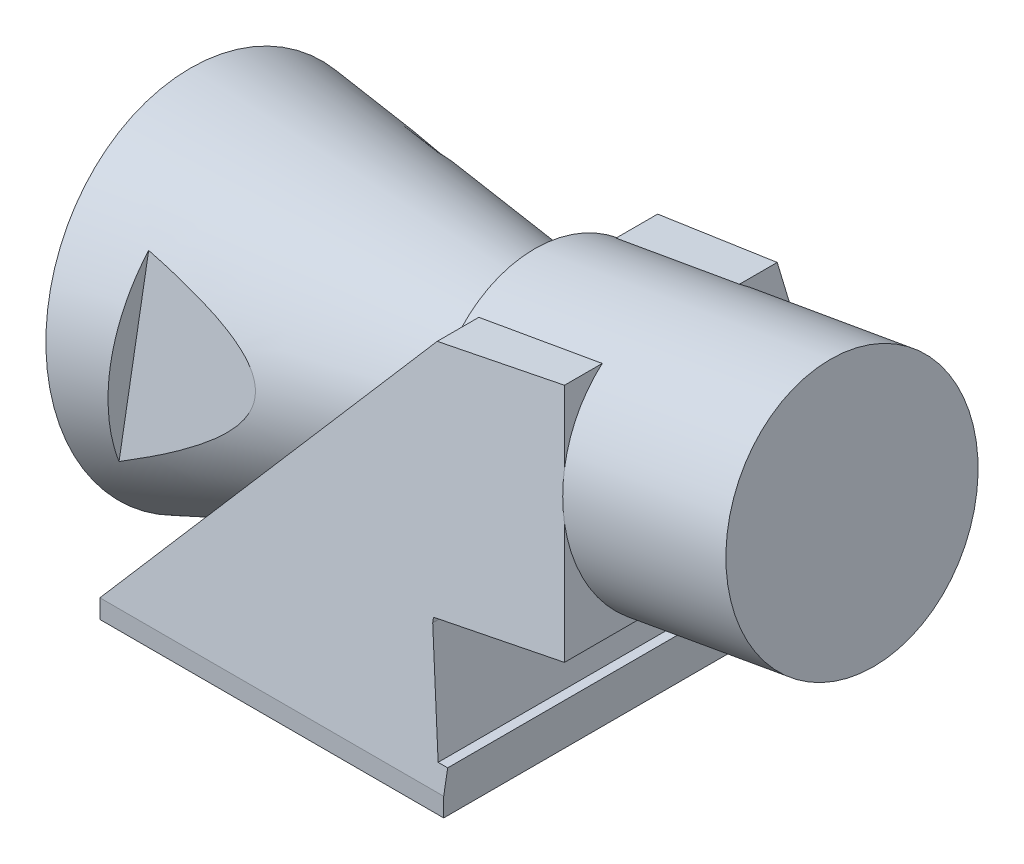
ISO-10303-21;
HEADER;
FILE_DESCRIPTION(('STEP AP214'),'2;1');
FILE_NAME('part.step','',(''),(''),'','','');
FILE_SCHEMA(('AUTOMOTIVE_DESIGN { 1 0 10303 214 1 1 1 1 }'));
ENDSEC;
DATA;
#1=APPLICATION_CONTEXT('core data for automotive mechanical design processes');
#2=APPLICATION_PROTOCOL_DEFINITION('international standard','automotive_design',2000,#1);
#3=PRODUCT_CONTEXT('',#1,'mechanical');
#4=PRODUCT('Part','Part','',(#3));
#5=PRODUCT_RELATED_PRODUCT_CATEGORY('part','',(#4));
#6=PRODUCT_DEFINITION_FORMATION('','',#4);
#7=PRODUCT_DEFINITION_CONTEXT('part definition',#1,'design');
#8=PRODUCT_DEFINITION('design','',#6,#7);
#9=PRODUCT_DEFINITION_SHAPE('','',#8);
#10=(LENGTH_UNIT() NAMED_UNIT(*) SI_UNIT(.MILLI.,.METRE.));
#11=(NAMED_UNIT(*) PLANE_ANGLE_UNIT() SI_UNIT($,.RADIAN.));
#12=(NAMED_UNIT(*) SI_UNIT($,.STERADIAN.) SOLID_ANGLE_UNIT());
#13=UNCERTAINTY_MEASURE_WITH_UNIT(LENGTH_MEASURE(1.E-05),#10,'distance_accuracy_value','');
#14=(GEOMETRIC_REPRESENTATION_CONTEXT(3) GLOBAL_UNCERTAINTY_ASSIGNED_CONTEXT((#13)) GLOBAL_UNIT_ASSIGNED_CONTEXT((#10,
#11,#12)) REPRESENTATION_CONTEXT('',''));
#15=CARTESIAN_POINT('',(0.,0.,0.));
#16=DIRECTION('',(0.,0.,1.));
#17=DIRECTION('',(1.,0.,0.));
#18=AXIS2_PLACEMENT_3D('',#15,#16,#17);
#19=CARTESIAN_POINT('',(-11.6796186626593,44.6229984059863,40.75));
#20=DIRECTION('',(-0.98480775301221,-0.17364817766692,0.));
#21=DIRECTION('',(0.17364817766692,-0.98480775301221,0.));
#22=AXIS2_PLACEMENT_3D('',#19,#20,#21);
#23=PLANE('',#22);
#24=CARTESIAN_POINT('',(-11.6796186626593,44.6229984059863,40.75));
#25=DIRECTION('',(0.98480775301221,0.17364817766692,0.));
#26=DIRECTION('',(-0.17364817766692,0.98480775301221,0.));
#27=AXIS2_PLACEMENT_3D('',#24,#25,#26);
#28=CIRCLE('',#27,41.5);
#29=CARTESIAN_POINT('',(-18.8860180358365,85.4925201559931,40.75));
#30=VERTEX_POINT('',#29);
#31=EDGE_CURVE('E83',#30,#30,#28,.T.);
#32=ORIENTED_EDGE('',*,*,#31,.F.);
#33=EDGE_LOOP('',(#32));
#34=FACE_BOUND('',#33,.T.);
#35=ADVANCED_FACE('F48',(#34),#23,.T.);
#36=CARTESIAN_POINT('',(101.573272933745,64.5925388376821,40.75));
#37=DIRECTION('',(-0.98480775301221,-0.17364817766692,0.));
#38=DIRECTION('',(0.17364817766692,-0.98480775301221,0.));
#39=AXIS2_PLACEMENT_3D('',#36,#37,#38);
#40=CONICAL_SURFACE('',#39,15.,0.226481286934043);
#41=CARTESIAN_POINT('',(-0.000199999999998304,71.2990520385838,11.7710295934015));
#42=CARTESIAN_POINT('',(0.435160106182231,71.205341070177,11.7545058212831));
#43=CARTESIAN_POINT('',(0.870216553735556,71.1102651309721,11.7377413679851));
#44=CARTESIAN_POINT('',(1.73965924894494,70.9171621699666,11.7036921059051));
#45=CARTESIAN_POINT('',(2.17404548789202,70.8191351101518,11.6864072904202));
#46=CARTESIAN_POINT('',(3.47625750172941,70.520260239672,11.6337075868989));
#47=CARTESIAN_POINT('',(4.34296623400866,70.3146552196313,11.5974538744966));
#48=CARTESIAN_POINT('',(6.07066394761909,69.8890780589034,11.522413138687));
#49=CARTESIAN_POINT('',(6.93166143596506,69.6691394991109,11.4836320364974));
#50=CARTESIAN_POINT('',(8.64880008979963,69.2117323407102,11.4029788133022));
#51=CARTESIAN_POINT('',(9.50494164977194,68.9742651886991,11.3611069473706));
#52=CARTESIAN_POINT('',(10.967846188311,68.5488105068129,11.2860878078854));
#53=CARTESIAN_POINT('',(11.5761609709877,68.366002713395,11.253853861622));
#54=CARTESIAN_POINT('',(12.7887411488574,67.987818490469,11.1871697794419));
#55=CARTESIAN_POINT('',(13.3930066941693,67.7924425297836,11.1527197261912));
#56=CARTESIAN_POINT('',(14.5982907543851,67.3863446926723,11.0811137207012));
#57=CARTESIAN_POINT('',(15.1992936469331,67.1755776294454,11.0439498008096));
#58=CARTESIAN_POINT('',(16.3946070502439,66.7364657170697,10.9665225231073));
#59=CARTESIAN_POINT('',(16.9889182244486,66.5081226283804,10.926259475713));
#60=CARTESIAN_POINT('',(18.1895452742759,66.0217900892355,10.8405059274653));
#61=CARTESIAN_POINT('',(18.7955461571921,65.7630394757908,10.7948812130402));
#62=CARTESIAN_POINT('',(19.9947628310178,65.2172717111322,10.6986476309299));
#63=CARTESIAN_POINT('',(20.5879716641027,64.930239627363,10.6480361302324));
#64=CARTESIAN_POINT('',(21.7530678930287,64.3219128037616,10.5407716981428));
#65=CARTESIAN_POINT('',(22.3250374429331,64.0007739752221,10.4841462581182));
#66=CARTESIAN_POINT('',(23.161100950813,63.4852275205651,10.3932415083536));
#67=CARTESIAN_POINT('',(23.4360198154801,63.3078276846645,10.3619611309111));
#68=CARTESIAN_POINT('',(23.9767357150492,62.9400737841296,10.297116195986));
#69=CARTESIAN_POINT('',(24.2425353308603,62.7497234309826,10.2635522929388));
#70=CARTESIAN_POINT('',(24.6935668370052,62.4067105839493,10.2030698732772));
#71=CARTESIAN_POINT('',(24.881461272593,62.2574513339286,10.1767514403782));
#72=CARTESIAN_POINT('',(25.249687218276,61.9501611427662,10.1225678887692));
#73=CARTESIAN_POINT('',(25.4300187870082,61.7921302696554,10.0947027820549));
#74=CARTESIAN_POINT('',(25.9578278237647,61.3032914429642,10.0085073076914));
#75=CARTESIAN_POINT('',(26.2918083418342,60.9579678245868,9.94761743669555));
#76=CARTESIAN_POINT('',(26.9107326222486,60.2171144611819,9.81698499997866));
#77=CARTESIAN_POINT('',(27.1949043618945,59.8209356629508,9.74712798866588));
#78=CARTESIAN_POINT('',(27.5603025372161,59.1930953093524,9.63642279474894));
#79=CARTESIAN_POINT('',(27.6718726942678,58.9784646348594,9.59857761594817));
#80=CARTESIAN_POINT('',(27.8717790482545,58.5390134509261,9.52109051551645));
#81=CARTESIAN_POINT('',(27.960125336786,58.3141974173396,9.48144938309929));
#82=CARTESIAN_POINT('',(28.1493540472526,57.7388423973135,9.37999876958263));
#83=CARTESIAN_POINT('',(28.2335566399051,57.382785549728,9.3172163406873));
#84=CARTESIAN_POINT('',(28.3378171935902,56.6616987556132,9.19006928345231));
#85=CARTESIAN_POINT('',(28.3578504134117,56.2966654027404,9.12570405448236));
#86=CARTESIAN_POINT('',(28.3373183510935,55.5705372131099,8.99766806319751));
#87=CARTESIAN_POINT('',(28.2970748120509,55.2094317548338,8.93399542802234));
#88=CARTESIAN_POINT('',(28.1653694778048,54.4966722464765,8.80831669594246));
#89=CARTESIAN_POINT('',(28.0738887026154,54.1450217494477,8.74631122553675));
#90=CARTESIAN_POINT('',(27.8610169269371,53.4894098579416,8.63070916019091));
#91=CARTESIAN_POINT('',(27.7435124873957,53.1841870573855,8.57689014532548));
#92=CARTESIAN_POINT('',(27.481686046075,52.584973231558,8.47123258061855));
#93=CARTESIAN_POINT('',(27.3373430283436,52.2909912273993,8.41939562144262));
#94=CARTESIAN_POINT('',(27.0267452798366,51.7132275646986,8.31752029923555));
#95=CARTESIAN_POINT('',(26.8604124008732,51.4294871093137,8.26748920143268));
#96=CARTESIAN_POINT('',(26.5105645767159,50.8726858593264,8.16931011816773));
#97=CARTESIAN_POINT('',(26.3270548055473,50.5996218836652,8.12116157179915));
#98=CARTESIAN_POINT('',(25.8601942559215,49.9421287209082,8.00522778757374));
#99=CARTESIAN_POINT('',(25.5691417817076,49.5630163929562,7.93838005543661));
#100=CARTESIAN_POINT('',(24.9649612946803,48.8221379086977,7.80774318923545));
#101=CARTESIAN_POINT('',(24.6518214119691,48.4603812575981,7.74395573119586));
#102=CARTESIAN_POINT('',(24.0079475442274,47.7511719436742,7.61890299418134));
#103=CARTESIAN_POINT('',(23.6771798167594,47.40374914972,7.55764298189411));
#104=CARTESIAN_POINT('',(23.0022886657867,46.7219180042016,7.43741775465186));
#105=CARTESIAN_POINT('',(22.6581677711202,46.3875072122027,7.37845210938237));
#106=CARTESIAN_POINT('',(21.955888803083,45.7268343647767,7.26195766095969));
#107=CARTESIAN_POINT('',(21.5976304708545,45.4006760346427,7.20444714737423));
#108=CARTESIAN_POINT('',(20.8720836722728,44.7582538492002,7.09117078307503));
#109=CARTESIAN_POINT('',(20.5047948660538,44.4419903673099,7.03540499820496));
#110=CARTESIAN_POINT('',(19.7631554492044,43.8185134829878,6.92546920165093));
#111=CARTESIAN_POINT('',(19.3888137995527,43.5112897198247,6.8712973630905));
#112=CARTESIAN_POINT('',(18.633792511066,42.9044796005825,6.76430036690118));
#113=CARTESIAN_POINT('',(18.2531126213925,42.6048935479625,6.71147526278032));
#114=CARTESIAN_POINT('',(17.1531108786781,41.75501665557,6.56161903637087));
#115=CARTESIAN_POINT('',(16.4270611446611,41.2131637381971,6.46607574746244));
#116=CARTESIAN_POINT('',(14.9605465840548,40.1487006842324,6.27838219108114));
#117=CARTESIAN_POINT('',(14.2200804606338,39.6260922911296,6.18623223103242));
#118=CARTESIAN_POINT('',(12.7270981101662,38.5964420353106,6.00467711023817));
#119=CARTESIAN_POINT('',(11.9745715900632,38.08941467935,5.91527450742505));
#120=CARTESIAN_POINT('',(10.460290361537,37.0889038197135,5.73885744837932));
#121=CARTESIAN_POINT('',(9.69853544909536,36.5954206162578,5.65184304508364));
#122=CARTESIAN_POINT('',(8.1992322301813,35.6403126145916,5.48343173489935));
#123=CARTESIAN_POINT('',(7.46199322315307,35.1782160475497,5.4019516424371));
#124=CARTESIAN_POINT('',(5.98160135683655,34.2632859715363,5.2406247845743));
#125=CARTESIAN_POINT('',(5.23844839400872,33.81045262524,5.16077804785777));
#126=CARTESIAN_POINT('',(3.74851112992005,32.9137652760925,5.00266787494313));
#127=CARTESIAN_POINT('',(3.00173633303148,32.4698959350585,4.92440173420955));
#128=CARTESIAN_POINT('',(1.5038600959817,31.589384445353,4.76914380175066));
#129=CARTESIAN_POINT('',(0.752758896593634,31.1527418996351,4.69215194001537));
#130=CARTESIAN_POINT('',(-0.000199999999992105,30.7192512359947,4.61571584013035));
#131=B_SPLINE_CURVE_WITH_KNOTS('',3,(#41,#42,#43,#44,#45,#46,#47,#48,#49,#50,#51,#52,#53,#54,
#55,#56,#57,#58,#59,#60,#61,#62,#63,#64,#65,#66,#67,#68,#69,#70,#71,#72,#73,#74,#75,#76,#77,#78,
#79,#80,#81,#82,#83,#84,#85,#86,#87,#88,#89,#90,#91,#92,#93,#94,#95,#96,#97,#98,#99,#100,#101,
#102,#103,#104,#105,#106,#107,#108,#109,#110,#111,#112,#113,#114,#115,#116,#117,#118,#119,#120,
#121,#122,#123,#124,#125,#126,#127,#128,#129,#130),.UNSPECIFIED.,.F.,.F.,(4,2,2,2,2,2,2,2,2,2,2,
2,2,2,2,2,2,2,2,2,2,2,2,2,2,2,2,2,2,2,2,2,2,2,2,2,2,2,2,2,2,2,2,2,4),(0.,1.33690936235621,
2.67383595320775,5.34821205124334,8.01653338542901,10.6846347544645,12.5925398124733,
14.5003737422552,16.4140534266764,18.327541680871,20.308460527047,22.2904309567445,
24.2637023401975,25.2494385481461,26.2348934344783,26.958841833134,27.6827846177785,
29.1318329388121,30.6016645023055,31.3350298718961,32.068076039407,33.1758664137998,
34.2840838576403,35.3864069417529,36.4891386335282,37.4820382813143,38.4757187188698,
39.4730305419085,40.4700429154378,41.9167158770173,43.3641723008735,44.8145065280487,
46.2645674170984,47.7280146997169,49.1915171443736,50.6532711414507,52.1150831262378,
54.8475598458512,57.5802835126277,60.315478807529,63.0507346819852,65.6723414908511,
68.2939942993481,70.9106976701191,73.5272567965077),.UNSPECIFIED.);
#132=CARTESIAN_POINT('',(0.,71.2990089900072,11.771022002776));
#133=VERTEX_POINT('',#132);
#134=CARTESIAN_POINT('',(0.,30.7193663687056,4.61573614113365));
#135=VERTEX_POINT('',#134);
#136=EDGE_CURVE('E12',#133,#135,#131,.T.);
#137=ORIENTED_EDGE('',*,*,#136,.F.);
#138=CARTESIAN_POINT('',(0.,45.0803062310774,40.75));
#139=DIRECTION('',(1.,0.,0.));
#140=DIRECTION('',(0.,-1.,0.));
#141=AXIS2_PLACEMENT_3D('',#138,#139,#140);
#142=ELLIPSE('',#141,39.4302327339204,38.7991314976318);
#143=EDGE_CURVE('E60',#133,#135,#142,.F.);
#144=ORIENTED_EDGE('',*,*,#143,.T.);
#145=EDGE_LOOP('',(#137,#144));
#146=FACE_BOUND('',#145,.T.);
#147=CARTESIAN_POINT('',(-0.000200000000000518,30.7192512359947,76.8842841598697));
#148=CARTESIAN_POINT('',(0.482121532792821,30.9969100225923,76.8353254243617));
#149=CARTESIAN_POINT('',(0.9636663721107,31.275876479579,76.7861361112823));
#150=CARTESIAN_POINT('',(1.92505833489945,31.8366421029591,76.6872580020266));
#151=CARTESIAN_POINT('',(2.40490544201656,32.1184412965396,76.6375692010565));
#152=CARTESIAN_POINT('',(3.84185058208182,32.9685129597017,76.4876786313053));
#153=CARTESIAN_POINT('',(4.79617024098675,33.5413548556477,76.3866711493698));
#154=CARTESIAN_POINT('',(6.7023290398536,34.7052866639421,76.1814385678627));
#155=CARTESIAN_POINT('',(7.65410660201377,35.2964745669225,76.0771961898988));
#156=CARTESIAN_POINT('',(9.54631258270044,36.4960515110091,75.8656784092206));
#157=CARTESIAN_POINT('',(10.4867420748121,37.1044389064608,75.7584032966795));
#158=CARTESIAN_POINT('',(12.3563742830883,38.3441019336958,75.5398172579912));
#159=CARTESIAN_POINT('',(13.2855314430939,38.9754445784751,75.4284945156448));
#160=CARTESIAN_POINT('',(14.6652664896786,39.9421005629862,75.2580469845122));
#161=CARTESIAN_POINT('',(15.1229108350258,40.2676420949478,75.2006452290862));
#162=CARTESIAN_POINT('',(16.0327063505792,40.9260779529705,75.0845452222509));
#163=CARTESIAN_POINT('',(16.4848576602598,41.258972091733,75.0258470038674));
#164=CARTESIAN_POINT('',(17.3814913885476,41.9321476651657,74.9071479875173));
#165=CARTESIAN_POINT('',(17.8259915396731,42.2724061559827,74.8471512351711));
#166=CARTESIAN_POINT('',(18.7073750674528,42.9623389876337,74.7254974620744));
#167=CARTESIAN_POINT('',(19.1442588211909,43.3120128601236,74.6638405239057));
#168=CARTESIAN_POINT('',(20.0086642851516,44.0220387869147,74.5386437960099));
#169=CARTESIAN_POINT('',(20.4361902369433,44.3823858215249,74.4751048913898));
#170=CARTESIAN_POINT('',(21.2799784460327,45.1156113285826,74.3458174515519));
#171=CARTESIAN_POINT('',(21.6962421119486,45.48848822067,74.2800691949942));
#172=CARTESIAN_POINT('',(22.3784024391404,46.1223461855488,74.1683029338491));
#173=CARTESIAN_POINT('',(22.6482132212217,46.3792416636011,74.1230053298465));
#174=CARTESIAN_POINT('',(23.1804785335043,46.9004104609067,74.0311092093781));
#175=CARTESIAN_POINT('',(23.4429320802703,47.1646847571454,73.9845105206435));
#176=CARTESIAN_POINT('',(23.9604737039553,47.7029745148441,73.8895955129222));
#177=CARTESIAN_POINT('',(24.2155124610078,47.9770361355672,73.841271054812));
#178=CARTESIAN_POINT('',(24.7148043793626,48.5345415213348,73.7429678134109));
#179=CARTESIAN_POINT('',(24.9590577782162,48.8179850794979,73.6929890665988));
#180=CARTESIAN_POINT('',(25.4910507383607,49.4643252202966,73.579021861061));
#181=CARTESIAN_POINT('',(25.7752768224279,49.8300551252974,73.5145338111575));
#182=CARTESIAN_POINT('',(26.3173598413364,50.5806171819158,73.3821894698796));
#183=CARTESIAN_POINT('',(26.5751973000297,50.9654631354081,73.3143307448625));
#184=CARTESIAN_POINT('',(27.0532924740506,51.7537314370833,73.1753377752399));
#185=CARTESIAN_POINT('',(27.2738072359003,52.1570001996925,73.104230611915));
#186=CARTESIAN_POINT('',(27.6660803287029,52.9855468360177,72.9581354851556));
#187=CARTESIAN_POINT('',(27.8379402352458,53.4107766331101,72.883155998927));
#188=CARTESIAN_POINT('',(28.0956817436865,54.219390593033,72.7405755408151));
#189=CARTESIAN_POINT('',(28.1903843630803,54.5999744925767,72.6734683309023));
#190=CARTESIAN_POINT('',(28.3186023840318,55.3711212772078,72.5374943466853));
#191=CARTESIAN_POINT('',(28.3521913899719,55.7616715829812,72.4686297904535));
#192=CARTESIAN_POINT('',(28.3479984715197,56.5460442116976,72.3303237330816));
#193=CARTESIAN_POINT('',(28.3096258942319,56.9398669664937,72.2608821557941));
#194=CARTESIAN_POINT('',(28.1582396017339,57.7134756463047,72.1244740730331));
#195=CARTESIAN_POINT('',(28.0451967444454,58.0932560297749,72.0575085446836));
#196=CARTESIAN_POINT('',(27.766234546661,58.79408705672,71.9339331257155));
#197=CARTESIAN_POINT('',(27.6059190650831,59.1173561097729,71.8769320696342));
#198=CARTESIAN_POINT('',(27.2412273816014,59.7384713512388,71.7674126944345));
#199=CARTESIAN_POINT('',(27.0368441884998,60.036313495278,71.7148950884484));
#200=CARTESIAN_POINT('',(26.6149130671938,60.5800740917758,71.6190154242397));
#201=CARTESIAN_POINT('',(26.4003082530617,60.8282484707096,71.5752555853131));
#202=CARTESIAN_POINT('',(25.9497026411743,61.3051586583908,71.4911634518502));
#203=CARTESIAN_POINT('',(25.7136851028192,61.5338789824262,71.4508338876863));
#204=CARTESIAN_POINT('',(25.2245018674398,61.974476955686,71.3731445773552));
#205=CARTESIAN_POINT('',(24.9712759594492,62.1862891632226,71.335796370323));
#206=CARTESIAN_POINT('',(24.4522994541655,62.5941713907208,71.2638757286636));
#207=CARTESIAN_POINT('',(24.1865526755258,62.7902461616412,71.2293024563141));
#208=CARTESIAN_POINT('',(23.5233916120402,63.2539095110396,71.1475460978496));
#209=CARTESIAN_POINT('',(23.1205558793342,63.5139593166877,71.1016923007858));
#210=CARTESIAN_POINT('',(22.3000433713434,64.0104403689317,71.0141492958647));
#211=CARTESIAN_POINT('',(21.8823586705189,64.24685873782,70.9724623586946));
#212=CARTESIAN_POINT('',(21.03532321375,64.7004171676512,70.8924877701876));
#213=CARTESIAN_POINT('',(20.605950896366,64.9175179283932,70.8542070485364));
#214=CARTESIAN_POINT('',(19.7390864166859,65.3350545121521,70.7805840833869));
#215=CARTESIAN_POINT('',(19.301595806295,65.5354934809254,70.7452412852068));
#216=CARTESIAN_POINT('',(18.4168501383076,65.9237672686014,70.6767781405376));
#217=CARTESIAN_POINT('',(17.9695456933223,66.1114924206751,70.6436771312694));
#218=CARTESIAN_POINT('',(17.0698329088557,66.4746766216679,70.5796379576674));
#219=CARTESIAN_POINT('',(16.6174243699745,66.6501351894319,70.5486998781741));
#220=CARTESIAN_POINT('',(15.7090371161873,66.9902332767755,70.4887314092881));
#221=CARTESIAN_POINT('',(15.2530630542856,67.1548848908429,70.4596988873108));
#222=CARTESIAN_POINT('',(14.3377720307674,67.4749265286322,70.4032669116184));
#223=CARTESIAN_POINT('',(13.8784549722477,67.6303162826716,70.3758675054556));
#224=CARTESIAN_POINT('',(12.8615779070322,67.9642994780324,70.3169772570103));
#225=CARTESIAN_POINT('',(12.3033866689845,68.1410271488588,70.2858154004058));
#226=CARTESIAN_POINT('',(11.1837522840121,68.4841686401702,70.2253102972871));
#227=CARTESIAN_POINT('',(10.6223090832262,68.6505822892903,70.1959670809891));
#228=CARTESIAN_POINT('',(8.93347113585165,69.1364955413627,70.1102874643649));
#229=CARTESIAN_POINT('',(7.80206020803672,69.4425086229763,70.0563291016267));
#230=CARTESIAN_POINT('',(6.11406918881181,69.8765969127521,69.9797876241296));
#231=CARTESIAN_POINT('',(5.56028392765377,70.0154371642879,69.9553063417756));
#232=CARTESIAN_POINT('',(4.45117629077551,70.2870744561116,69.9074093582604));
#233=CARTESIAN_POINT('',(3.89585390362151,70.4198714513185,69.8839936650485));
#234=CARTESIAN_POINT('',(2.78438728579495,70.6799079456807,69.8381422151236));
#235=CARTESIAN_POINT('',(2.22824419940442,70.8071522059731,69.8157056188937));
#236=CARTESIAN_POINT('',(1.11483095038861,71.0566911155834,69.7717051763928));
#237=CARTESIAN_POINT('',(0.55756082199301,71.178985912921,69.750141304022));
#238=CARTESIAN_POINT('',(-0.00019999999998543,71.2990520385838,69.7289704065985));
#239=B_SPLINE_CURVE_WITH_KNOTS('',3,(#147,#148,#149,#150,#151,#152,#153,#154,#155,#156,#157,
#158,#159,#160,#161,#162,#163,#164,#165,#166,#167,#168,#169,#170,#171,#172,#173,#174,#175,#176,
#177,#178,#179,#180,#181,#182,#183,#184,#185,#186,#187,#188,#189,#190,#191,#192,#193,#194,#195,
#196,#197,#198,#199,#200,#201,#202,#203,#204,#205,#206,#207,#208,#209,#210,#211,#212,#213,#214,
#215,#216,#217,#218,#219,#220,#221,#222,#223,#224,#225,#226,#227,#228,#229,#230,#231,#232,#233,
#234,#235,#236,#237,#238),.UNSPECIFIED.,.F.,.F.,(4,2,2,2,2,2,2,2,2,2,2,2,2,2,2,2,2,2,2,2,2,2,2,
2,2,2,2,2,2,2,2,2,2,2,2,2,2,2,2,2,2,2,2,2,2,4),(0.,1.67604171649843,3.3520995341046,
6.70484788820612,10.0805209759551,13.4558721638046,16.8420245690177,18.5355977628918,
20.2291278647419,21.9179803242828,23.606748930781,25.2947355248139,26.9825100105114,
28.108268496232,29.2341767504635,30.3663728969443,31.4985440939458,32.9006023117203,
34.3036879686123,35.6966780926022,37.0867382904313,38.2764838685781,39.4647955828468,
40.6629035425833,41.861479372558,42.9533419019089,44.0453777792891,45.036902074187,
46.0292083410651,47.0251857454854,48.0208613354323,49.4647317367428,50.9093847191607,
52.356912570134,53.804166503312,55.2626316616706,56.721153996071,58.1780151830084,
59.6349187694377,61.3937778772017,63.1526662001336,66.6719957948362,68.3863251968169,
70.1006673851557,71.8135095238537,73.5263004000111),.UNSPECIFIED.);
#240=CARTESIAN_POINT('',(0.,30.7193663687056,76.8842638588664));
#241=VERTEX_POINT('',#240);
#242=CARTESIAN_POINT('',(0.,71.2990089900072,69.728977997224));
#243=VERTEX_POINT('',#242);
#244=EDGE_CURVE('E82',#241,#243,#239,.T.);
#245=ORIENTED_EDGE('',*,*,#244,.F.);
#246=CARTESIAN_POINT('',(0.,45.0803062310774,40.75));
#247=DIRECTION('',(1.,0.,0.));
#248=DIRECTION('',(0.,-1.,0.));
#249=AXIS2_PLACEMENT_3D('',#246,#247,#248);
#250=ELLIPSE('',#249,39.4302327339204,38.7991314976318);
#251=EDGE_CURVE('E78',#241,#243,#250,.F.);
#252=ORIENTED_EDGE('',*,*,#251,.T.);
#253=EDGE_LOOP('',(#245,#252));
#254=FACE_BOUND('',#253,.T.);
#255=ORIENTED_EDGE('',*,*,#31,.T.);
#256=EDGE_LOOP('',(#255));
#257=FACE_BOUND('',#256,.T.);
#258=CARTESIAN_POINT('',(101.573272933745,64.5925388376821,40.75));
#259=DIRECTION('',(0.98480775301221,0.17364817766692,0.));
#260=DIRECTION('',(-0.17364817766692,0.98480775301221,0.));
#261=AXIS2_PLACEMENT_3D('',#258,#259,#260);
#262=CIRCLE('',#261,15.);
#263=CARTESIAN_POINT('',(98.968550268741,79.3646551328653,40.75));
#264=VERTEX_POINT('',#263);
#265=EDGE_CURVE('E121',#264,#264,#262,.T.);
#266=ORIENTED_EDGE('',*,*,#265,.F.);
#267=EDGE_LOOP('',(#266));
#268=FACE_BOUND('',#267,.T.);
#269=ADVANCED_FACE('F88',(#146,#254,#257,#268),#40,.T.);
#270=CARTESIAN_POINT('',(98.968550268741,79.3646551328653,40.75));
#271=DIRECTION('',(0.98480775301221,0.17364817766692,0.));
#272=DIRECTION('',(-0.17364817766692,0.98480775301221,0.));
#273=AXIS2_PLACEMENT_3D('',#270,#271,#272);
#274=PLANE('',#273);
#275=ORIENTED_EDGE('',*,*,#265,.T.);
#276=EDGE_LOOP('',(#275));
#277=FACE_BOUND('',#276,.T.);
#278=ADVANCED_FACE('F103',(#277),#274,.T.);
#279=CARTESIAN_POINT('',(192.069974964755,4.54222590734084,81.5));
#280=DIRECTION('',(0.,-0.173648177666923,-0.984807753012209));
#281=DIRECTION('',(0.,0.984807753012209,-0.173648177666923));
#282=AXIS2_PLACEMENT_3D('',#279,#280,#281);
#283=PLANE('',#282);
#284=ORIENTED_EDGE('',*,*,#244,.T.);
#285=DIRECTION('',(0.,-0.984807753012209,0.173648177666923));
#286=VECTOR('',#285,1.);
#287=CARTESIAN_POINT('',(0.,4.54222590734083,81.5));
#288=LINE('',#287,#286);
#289=EDGE_CURVE('E72',#243,#241,#288,.T.);
#290=ORIENTED_EDGE('',*,*,#289,.T.);
#291=EDGE_LOOP('',(#284,#290));
#292=FACE_BOUND('',#291,.T.);
#293=ADVANCED_FACE('F86',(#292),#283,.F.);
#294=CARTESIAN_POINT('',(0.,0.,0.));
#295=DIRECTION('',(1.,0.,0.));
#296=DIRECTION('',(0.,1.,0.));
#297=AXIS2_PLACEMENT_3D('',#294,#295,#296);
#298=PLANE('',#297);
#299=ORIENTED_EDGE('',*,*,#289,.F.);
#300=ORIENTED_EDGE('',*,*,#251,.F.);
#301=EDGE_LOOP('',(#299,#300));
#302=FACE_BOUND('',#301,.T.);
#303=ADVANCED_FACE('F79',(#302),#298,.T.);
#304=CARTESIAN_POINT('',(192.069974964755,4.54222590734084,0.));
#305=DIRECTION('',(0.,-0.173648177666923,0.984807753012209));
#306=DIRECTION('',(0.,-0.984807753012209,-0.173648177666923));
#307=AXIS2_PLACEMENT_3D('',#304,#305,#306);
#308=PLANE('',#307);
#309=ORIENTED_EDGE('',*,*,#136,.T.);
#310=DIRECTION('',(0.,0.984807753012209,0.173648177666923));
#311=VECTOR('',#310,1.);
#312=CARTESIAN_POINT('',(0.,4.54222590734084,0.));
#313=LINE('',#312,#311);
#314=EDGE_CURVE('E66',#135,#133,#313,.T.);
#315=ORIENTED_EDGE('',*,*,#314,.T.);
#316=EDGE_LOOP('',(#309,#315));
#317=FACE_BOUND('',#316,.T.);
#318=ADVANCED_FACE('F104',(#317),#308,.F.);
#319=CARTESIAN_POINT('',(0.,0.,0.));
#320=DIRECTION('',(1.,0.,0.));
#321=DIRECTION('',(0.,1.,0.));
#322=AXIS2_PLACEMENT_3D('',#319,#320,#321);
#323=PLANE('',#322);
#324=ORIENTED_EDGE('',*,*,#314,.F.);
#325=ORIENTED_EDGE('',*,*,#143,.F.);
#326=EDGE_LOOP('',(#324,#325));
#327=FACE_BOUND('',#326,.T.);
#328=ADVANCED_FACE('F126',(#327),#323,.T.);
#329=CLOSED_SHELL('',(#35,#269,#278,#293,#303,#318,#328));
#330=MANIFOLD_SOLID_BREP('B2_NOT_SHOWN',#329);
#331=CARTESIAN_POINT('',(105.780577321312,40.73172995487,81.5));
#332=DIRECTION('',(-0.98480775301221,-0.17364817766692,0.));
#333=DIRECTION('',(0.17364817766692,-0.98480775301221,0.));
#334=AXIS2_PLACEMENT_3D('',#331,#332,#333);
#335=PLANE('',#334);
#336=DIRECTION('',(0.,0.,-1.));
#337=VECTOR('',#336,1.);
#338=CARTESIAN_POINT('',(97.0938104184405,89.9968331623877,81.5));
#339=LINE('',#338,#337);
#340=CARTESIAN_POINT('',(97.0938104184405,89.9968331623877,66.4320471150905));
#341=VERTEX_POINT('',#340);
#342=CARTESIAN_POINT('',(97.0938104184405,89.9968331623877,57.3141909455895));
#343=VERTEX_POINT('',#342);
#344=EDGE_CURVE('E361',#341,#343,#339,.T.);
#345=ORIENTED_EDGE('',*,*,#344,.F.);
#346=DIRECTION('',(-0.171087869746025,0.970287525247817,-0.171087869746029));
#347=VECTOR('',#346,1.);
#348=CARTESIAN_POINT('',(114.500761295398,-8.72289088108481,83.8389979920482));
#349=LINE('',#348,#347);
#350=CARTESIAN_POINT('',(99.7052399996384,75.1866800553277,69.0434766962884));
#351=VERTEX_POINT('',#350);
#352=EDGE_CURVE('E469',#351,#341,#349,.T.);
#353=ORIENTED_EDGE('',*,*,#352,.F.);
#354=CARTESIAN_POINT('',(101.437193869877,65.3642815586288,40.75));
#355=DIRECTION('',(-0.98480775301221,-0.17364817766692,0.));
#356=DIRECTION('',(0.17364817766692,-0.98480775301221,0.));
#357=AXIS2_PLACEMENT_3D('',#354,#355,#356);
#358=CIRCLE('',#357,30.);
#359=EDGE_CURVE('E404',#351,#343,#358,.T.);
#360=ORIENTED_EDGE('',*,*,#359,.T.);
#361=EDGE_LOOP('',(#345,#353,#360));
#362=FACE_BOUND('',#361,.T.);
#363=ADVANCED_FACE('F186',(#362),#335,.F.);
#364=DIRECTION('',(0.,0.,-1.));
#365=VECTOR('',#364,1.);
#366=CARTESIAN_POINT('',(105.780577321312,40.73172995487,81.5));
#367=LINE('',#366,#365);
#368=CARTESIAN_POINT('',(105.780577321312,40.73172995487,24.1858090544105));
#369=VERTEX_POINT('',#368);
#370=CARTESIAN_POINT('',(105.780577321312,40.73172995487,6.38118598203732));
#371=VERTEX_POINT('',#370);
#372=EDGE_CURVE('E363',#369,#371,#367,.T.);
#373=ORIENTED_EDGE('',*,*,#372,.T.);
#374=DIRECTION('',(0.171087869746025,-0.970287525247817,-0.171087869746029));
#375=VECTOR('',#374,1.);
#376=CARTESIAN_POINT('',(114.500761295398,-8.7228908810848,-2.33899799204817));
#377=LINE('',#376,#375);
#378=CARTESIAN_POINT('',(101.411395430425,65.5105917792625,10.7503678729245));
#379=VERTEX_POINT('',#378);
#380=EDGE_CURVE('E323',#379,#371,#377,.T.);
#381=ORIENTED_EDGE('',*,*,#380,.F.);
#382=EDGE_CURVE('E403',#379,#369,#358,.T.);
#383=ORIENTED_EDGE('',*,*,#382,.T.);
#384=EDGE_LOOP('',(#373,#381,#383));
#385=FACE_BOUND('',#384,.T.);
#386=ADVANCED_FACE('F483',(#385),#335,.F.);
#387=CARTESIAN_POINT('',(75.1104680569099,34.2375914511455,81.5));
#388=DIRECTION('',(-1.,0.,0.));
#389=DIRECTION('',(0.,0.,1.));
#390=AXIS2_PLACEMENT_3D('',#387,#388,#389);
#391=PLANE('',#390);
#392=DIRECTION('',(0.,0.,-1.));
#393=VECTOR('',#392,1.);
#394=CARTESIAN_POINT('',(75.1104680569099,34.2375914511455,81.5));
#395=LINE('',#394,#393);
#396=CARTESIAN_POINT('',(75.1104680569099,34.2375914511455,25.9271151401922));
#397=VERTEX_POINT('',#396);
#398=CARTESIAN_POINT('',(75.1104680569099,34.2375914511455,5.23609414737305));
#399=VERTEX_POINT('',#398);
#400=EDGE_CURVE('E369',#397,#399,#395,.T.);
#401=ORIENTED_EDGE('',*,*,#400,.T.);
#402=DIRECTION('',(0.,0.984807753012209,0.173648177666923));
#403=VECTOR('',#402,1.);
#404=CARTESIAN_POINT('',(75.1104680569099,47.2794874562904,7.53573229267394));
#405=LINE('',#404,#403);
#406=CARTESIAN_POINT('',(75.1104680569099,35.3237621902795,5.42761535433841));
#407=VERTEX_POINT('',#406);
#408=EDGE_CURVE('E443',#399,#407,#405,.T.);
#409=ORIENTED_EDGE('',*,*,#408,.T.);
#410=DIRECTION('',(0.,0.,-1.));
#411=VECTOR('',#410,1.);
#412=CARTESIAN_POINT('',(75.1104680569099,35.3237621902795,81.5));
#413=LINE('',#412,#411);
#414=CARTESIAN_POINT('',(75.1104680569099,35.3237621902795,24.1858090544106));
#415=VERTEX_POINT('',#414);
#416=EDGE_CURVE('E366',#415,#407,#413,.T.);
#417=ORIENTED_EDGE('',*,*,#416,.F.);
#418=CARTESIAN_POINT('',(75.1104680569099,60.7221694840891,40.75));
#419=DIRECTION('',(-1.,0.,0.));
#420=DIRECTION('',(0.,1.,0.));
#421=AXIS2_PLACEMENT_3D('',#418,#419,#420);
#422=ELLIPSE('',#421,30.4627983565723,30.);
#423=EDGE_CURVE('E485',#415,#397,#422,.T.);
#424=ORIENTED_EDGE('',*,*,#423,.T.);
#425=EDGE_LOOP('',(#401,#409,#417,#424));
#426=FACE_BOUND('',#425,.T.);
#427=ADVANCED_FACE('F544',(#426),#391,.F.);
#428=CARTESIAN_POINT('',(75.1104680569099,35.3237621902795,81.5));
#429=DIRECTION('',(-0.17364817766692,0.98480775301221,0.));
#430=DIRECTION('',(-0.98480775301221,-0.17364817766692,0.));
#431=AXIS2_PLACEMENT_3D('',#428,#429,#430);
#432=PLANE('',#431);
#433=CARTESIAN_POINT('',(105.780577321312,40.73172995487,75.1188140179627));
#434=VERTEX_POINT('',#433);
#435=CARTESIAN_POINT('',(105.780577321312,40.73172995487,57.3141909455895));
#436=VERTEX_POINT('',#435);
#437=EDGE_CURVE('E364',#434,#436,#367,.T.);
#438=ORIENTED_EDGE('',*,*,#437,.F.);
#439=DIRECTION('',(-0.984346441568215,-0.173566836012835,0.0306045161452631));
#440=VECTOR('',#439,1.);
#441=CARTESIAN_POINT('',(74.9469587205855,35.2949310826877,76.0774683478137));
#442=LINE('',#441,#440);
#443=CARTESIAN_POINT('',(75.1104680569099,35.3237621902795,76.0723846456616));
#444=VERTEX_POINT('',#443);
#445=EDGE_CURVE('E455',#434,#444,#442,.T.);
#446=ORIENTED_EDGE('',*,*,#445,.T.);
#447=CARTESIAN_POINT('',(75.1104680569099,35.3237621902795,57.3141909455894));
#448=VERTEX_POINT('',#447);
#449=EDGE_CURVE('E367',#444,#448,#413,.T.);
#450=ORIENTED_EDGE('',*,*,#449,.T.);
#451=DIRECTION('',(0.98480775301221,0.173648177666919,0.));
#452=VECTOR('',#451,1.);
#453=CARTESIAN_POINT('',(73.7743253484157,35.0881641806951,57.3141909455894));
#454=LINE('',#453,#452);
#455=EDGE_CURVE('E408',#448,#436,#454,.T.);
#456=ORIENTED_EDGE('',*,*,#455,.T.);
#457=EDGE_LOOP('',(#438,#446,#450,#456));
#458=FACE_BOUND('',#457,.T.);
#459=ADVANCED_FACE('F520',(#458),#432,.F.);
#460=CARTESIAN_POINT('',(101.411395430425,65.5105917792625,70.7496321270755));
#461=VERTEX_POINT('',#460);
#462=EDGE_CURVE('E401',#436,#461,#358,.T.);
#463=ORIENTED_EDGE('',*,*,#462,.T.);
#464=EDGE_CURVE('E468',#434,#461,#349,.T.);
#465=ORIENTED_EDGE('',*,*,#464,.F.);
#466=ORIENTED_EDGE('',*,*,#437,.T.);
#467=EDGE_LOOP('',(#463,#465,#466));
#468=FACE_BOUND('',#467,.T.);
#469=ADVANCED_FACE('F524',(#468),#335,.F.);
#470=CARTESIAN_POINT('',(97.0938104184405,89.9968331623877,81.5));
#471=DIRECTION('',(0.173648177666921,-0.98480775301221,0.));
#472=DIRECTION('',(0.98480775301221,0.173648177666921,0.));
#473=AXIS2_PLACEMENT_3D('',#470,#471,#472);
#474=PLANE('',#473);
#475=CARTESIAN_POINT('',(97.0938104184405,89.9968331623877,24.1858090544105));
#476=VERTEX_POINT('',#475);
#477=CARTESIAN_POINT('',(97.0938104184405,89.9968331623877,15.0679528849095));
#478=VERTEX_POINT('',#477);
#479=EDGE_CURVE('E360',#476,#478,#339,.T.);
#480=ORIENTED_EDGE('',*,*,#479,.T.);
#481=DIRECTION('',(-0.984346441568215,-0.173566836012835,-0.0306045161452632));
#482=VECTOR('',#481,1.);
#483=CARTESIAN_POINT('',(99.0951055039105,90.3497154823153,15.1301755589277));
#484=LINE('',#483,#482);
#485=CARTESIAN_POINT('',(67.296196513484,84.7427098702105,14.1415091885299));
#486=VERTEX_POINT('',#485);
#487=EDGE_CURVE('E335',#478,#486,#484,.T.);
#488=ORIENTED_EDGE('',*,*,#487,.T.);
#489=DIRECTION('',(0.,0.,-1.));
#490=VECTOR('',#489,1.);
#491=CARTESIAN_POINT('',(67.296196513484,84.7427098702105,81.5));
#492=LINE('',#491,#490);
#493=CARTESIAN_POINT('',(67.296196513484,84.7427098702105,24.1858090544105));
#494=VERTEX_POINT('',#493);
#495=EDGE_CURVE('E334',#494,#486,#492,.T.);
#496=ORIENTED_EDGE('',*,*,#495,.F.);
#497=DIRECTION('',(0.98480775301221,0.173648177666919,0.));
#498=VECTOR('',#497,1.);
#499=CARTESIAN_POINT('',(65.0875584455437,84.3532673882128,24.1858090544105));
#500=LINE('',#499,#498);
#501=EDGE_CURVE('E350',#494,#476,#500,.T.);
#502=ORIENTED_EDGE('',*,*,#501,.T.);
#503=EDGE_LOOP('',(#480,#488,#496,#502));
#504=FACE_BOUND('',#503,.T.);
#505=ADVANCED_FACE('F390',(#504),#474,.F.);
#506=CARTESIAN_POINT('',(0.,4.54222590734084,81.5));
#507=DIRECTION('',(1.,0.,0.));
#508=DIRECTION('',(0.,1.,0.));
#509=AXIS2_PLACEMENT_3D('',#506,#507,#508);
#510=PLANE('',#509);
#511=DIRECTION('',(0.,-1.,0.));
#512=VECTOR('',#511,1.);
#513=CARTESIAN_POINT('',(0.,4.54222590734084,0.));
#514=LINE('',#513,#512);
#515=CARTESIAN_POINT('',(0.,4.54222590734084,0.));
#516=VERTEX_POINT('',#515);
#517=CARTESIAN_POINT('',(0.,0.,0.));
#518=VERTEX_POINT('',#517);
#519=EDGE_CURVE('E341',#516,#518,#514,.T.);
#520=ORIENTED_EDGE('',*,*,#519,.T.);
#521=DIRECTION('',(0.,0.,-1.));
#522=VECTOR('',#521,1.);
#523=CARTESIAN_POINT('',(0.,0.,81.5));
#524=LINE('',#523,#522);
#525=CARTESIAN_POINT('',(0.,0.,81.5));
#526=VERTEX_POINT('',#525);
#527=EDGE_CURVE('E375',#526,#518,#524,.T.);
#528=ORIENTED_EDGE('',*,*,#527,.F.);
#529=DIRECTION('',(0.,-1.,0.));
#530=VECTOR('',#529,1.);
#531=CARTESIAN_POINT('',(0.,4.54222590734084,81.5));
#532=LINE('',#531,#530);
#533=CARTESIAN_POINT('',(0.,4.54222590734083,81.5));
#534=VERTEX_POINT('',#533);
#535=EDGE_CURVE('E343',#534,#526,#532,.T.);
#536=ORIENTED_EDGE('',*,*,#535,.F.);
#537=DIRECTION('',(0.,0.,-1.));
#538=VECTOR('',#537,1.);
#539=CARTESIAN_POINT('',(0.,4.54222590734084,81.5));
#540=LINE('',#539,#538);
#541=EDGE_CURVE('E331',#534,#516,#540,.T.);
#542=ORIENTED_EDGE('',*,*,#541,.T.);
#543=EDGE_LOOP('',(#520,#528,#536,#542));
#544=FACE_BOUND('',#543,.T.);
#545=ADVANCED_FACE('F188',(#544),#510,.F.);
#546=CARTESIAN_POINT('',(0.,0.,81.5));
#547=DIRECTION('',(0.,1.,0.));
#548=DIRECTION('',(0.,0.,1.));
#549=AXIS2_PLACEMENT_3D('',#546,#547,#548);
#550=PLANE('',#549);
#551=DIRECTION('',(1.,0.,0.));
#552=VECTOR('',#551,1.);
#553=CARTESIAN_POINT('',(0.,0.,0.));
#554=LINE('',#553,#552);
#555=CARTESIAN_POINT('',(83.,0.,0.));
#556=VERTEX_POINT('',#555);
#557=EDGE_CURVE('E348',#518,#556,#554,.T.);
#558=ORIENTED_EDGE('',*,*,#557,.T.);
#559=DIRECTION('',(0.,0.,-1.));
#560=VECTOR('',#559,1.);
#561=CARTESIAN_POINT('',(83.,0.,81.5));
#562=LINE('',#561,#560);
#563=CARTESIAN_POINT('',(83.,0.,81.5));
#564=VERTEX_POINT('',#563);
#565=EDGE_CURVE('E372',#564,#556,#562,.T.);
#566=ORIENTED_EDGE('',*,*,#565,.F.);
#567=DIRECTION('',(1.,0.,0.));
#568=VECTOR('',#567,1.);
#569=CARTESIAN_POINT('',(0.,0.,81.5));
#570=LINE('',#569,#568);
#571=EDGE_CURVE('E344',#526,#564,#570,.T.);
#572=ORIENTED_EDGE('',*,*,#571,.F.);
#573=ORIENTED_EDGE('',*,*,#527,.T.);
#574=EDGE_LOOP('',(#558,#566,#572,#573));
#575=FACE_BOUND('',#574,.T.);
#576=ADVANCED_FACE('F496',(#575),#550,.F.);
#577=CARTESIAN_POINT('',(83.,0.,81.5));
#578=DIRECTION('',(-0.974462553198903,-0.224550066606704,0.));
#579=DIRECTION('',(0.224550066606704,-0.974462553198903,0.));
#580=AXIS2_PLACEMENT_3D('',#577,#578,#579);
#581=PLANE('',#580);
#582=DIRECTION('',(0.,0.,1.));
#583=VECTOR('',#582,1.);
#584=CARTESIAN_POINT('',(80.695652173913,10.,-10.2620669898219));
#585=LINE('',#584,#583);
#586=CARTESIAN_POINT('',(80.695652173913,10.,0.962352827147432));
#587=VERTEX_POINT('',#586);
#588=CARTESIAN_POINT('',(80.695652173913,10.,80.5376471728526));
#589=VERTEX_POINT('',#588);
#590=EDGE_CURVE('E431',#587,#589,#585,.T.);
#591=ORIENTED_EDGE('',*,*,#590,.F.);
#592=DIRECTION('',(-0.221306951553646,0.960388657685633,0.169342432316356));
#593=VECTOR('',#592,1.);
#594=CARTESIAN_POINT('',(79.9156367253194,13.3849727014441,1.55921484337364));
#595=LINE('',#594,#593);
#596=EDGE_CURVE('E446',#587,#399,#595,.T.);
#597=ORIENTED_EDGE('',*,*,#596,.T.);
#598=ORIENTED_EDGE('',*,*,#400,.F.);
#599=CARTESIAN_POINT('',(69.2457927951127,59.6880690023409,40.75));
#600=DIRECTION('',(-0.974462553198903,-0.224550066606704,0.));
#601=DIRECTION('',(0.224550066606704,-0.974462553198903,0.));
#602=AXIS2_PLACEMENT_3D('',#599,#600,#601);
#603=ELLIPSE('',#602,30.0405250506614,30.);
#604=CARTESIAN_POINT('',(75.1104680569099,34.2375914511455,55.5728848598078));
#605=VERTEX_POINT('',#604);
#606=EDGE_CURVE('E487',#397,#605,#603,.T.);
#607=ORIENTED_EDGE('',*,*,#606,.T.);
#608=CARTESIAN_POINT('',(75.1104680569099,34.2375914511455,76.263905852627));
#609=VERTEX_POINT('',#608);
#610=EDGE_CURVE('E370',#609,#605,#395,.T.);
#611=ORIENTED_EDGE('',*,*,#610,.F.);
#612=DIRECTION('',(0.221306951553646,-0.960388657685633,0.169342432316356));
#613=VECTOR('',#612,1.);
#614=CARTESIAN_POINT('',(82.9699843086853,0.130256773629813,82.2779491963262));
#615=LINE('',#614,#613);
#616=EDGE_CURVE('E461',#609,#589,#615,.T.);
#617=ORIENTED_EDGE('',*,*,#616,.T.);
#618=EDGE_LOOP('',(#591,#597,#598,#607,#611,#617));
#619=FACE_BOUND('',#618,.T.);
#620=ADVANCED_FACE('F506',(#619),#581,.F.);
#621=ORIENTED_EDGE('',*,*,#449,.F.);
#622=DIRECTION('',(0.,-0.984807753012209,0.173648177666923));
#623=VECTOR('',#622,1.);
#624=CARTESIAN_POINT('',(75.1104680569099,33.3421666157699,76.4217934103001));
#625=LINE('',#624,#623);
#626=EDGE_CURVE('E458',#444,#609,#625,.T.);
#627=ORIENTED_EDGE('',*,*,#626,.T.);
#628=ORIENTED_EDGE('',*,*,#610,.T.);
#629=EDGE_CURVE('E489',#605,#448,#422,.T.);
#630=ORIENTED_EDGE('',*,*,#629,.T.);
#631=EDGE_LOOP('',(#621,#627,#628,#630));
#632=FACE_BOUND('',#631,.T.);
#633=ADVANCED_FACE('F514',(#632),#391,.F.);
#634=ORIENTED_EDGE('',*,*,#416,.T.);
#635=DIRECTION('',(0.984346441568215,0.173566836012835,0.0306045161452631));
#636=VECTOR('',#635,1.);
#637=CARTESIAN_POINT('',(77.4021826155114,35.7278532990433,5.49886751947787));
#638=LINE('',#637,#636);
#639=EDGE_CURVE('E336',#407,#371,#638,.T.);
#640=ORIENTED_EDGE('',*,*,#639,.T.);
#641=ORIENTED_EDGE('',*,*,#372,.F.);
#642=DIRECTION('',(0.98480775301221,0.173648177666919,0.));
#643=VECTOR('',#642,1.);
#644=CARTESIAN_POINT('',(73.7743253484157,35.0881641806951,24.1858090544106));
#645=LINE('',#644,#643);
#646=EDGE_CURVE('E484',#369,#415,#645,.F.);
#647=ORIENTED_EDGE('',*,*,#646,.T.);
#648=EDGE_LOOP('',(#634,#640,#641,#647));
#649=FACE_BOUND('',#648,.T.);
#650=ADVANCED_FACE('F480',(#649),#432,.F.);
#651=CARTESIAN_POINT('',(99.7052399996384,75.1866800553277,12.4565233037116));
#652=VERTEX_POINT('',#651);
#653=EDGE_CURVE('E353',#476,#652,#358,.T.);
#654=ORIENTED_EDGE('',*,*,#653,.T.);
#655=EDGE_CURVE('E466',#478,#652,#377,.T.);
#656=ORIENTED_EDGE('',*,*,#655,.F.);
#657=ORIENTED_EDGE('',*,*,#479,.F.);
#658=EDGE_LOOP('',(#654,#656,#657));
#659=FACE_BOUND('',#658,.T.);
#660=ADVANCED_FACE('F540',(#659),#335,.F.);
#661=CARTESIAN_POINT('',(67.296196513484,84.7427098702105,67.3584908114701));
#662=VERTEX_POINT('',#661);
#663=CARTESIAN_POINT('',(67.296196513484,84.7427098702105,57.3141909455895));
#664=VERTEX_POINT('',#663);
#665=EDGE_CURVE('E358',#662,#664,#492,.T.);
#666=ORIENTED_EDGE('',*,*,#665,.F.);
#667=DIRECTION('',(0.984346441568215,0.173566836012835,-0.0306045161452631));
#668=VECTOR('',#667,1.);
#669=CARTESIAN_POINT('',(96.6398816089848,89.9167932659598,66.4461603083639));
#670=LINE('',#669,#668);
#671=EDGE_CURVE('E450',#662,#341,#670,.T.);
#672=ORIENTED_EDGE('',*,*,#671,.T.);
#673=ORIENTED_EDGE('',*,*,#344,.T.);
#674=DIRECTION('',(0.98480775301221,0.173648177666919,0.));
#675=VECTOR('',#674,1.);
#676=CARTESIAN_POINT('',(65.0875584455437,84.3532673882128,57.3141909455895));
#677=LINE('',#676,#675);
#678=EDGE_CURVE('E413',#343,#664,#677,.F.);
#679=ORIENTED_EDGE('',*,*,#678,.T.);
#680=EDGE_LOOP('',(#666,#672,#673,#679));
#681=FACE_BOUND('',#680,.T.);
#682=ADVANCED_FACE('F548',(#681),#474,.F.);
#683=CARTESIAN_POINT('',(67.296196513484,84.7427098702105,81.5));
#684=DIRECTION('',(0.766044443118975,-0.642787609686543,0.));
#685=DIRECTION('',(0.642787609686543,0.766044443118975,0.));
#686=AXIS2_PLACEMENT_3D('',#683,#684,#685);
#687=PLANE('',#686);
#688=ORIENTED_EDGE('',*,*,#495,.T.);
#689=DIRECTION('',(-0.637002796968531,-0.759150371779799,-0.133858692959635));
#690=VECTOR('',#689,1.);
#691=CARTESIAN_POINT('',(73.0397446792306,91.5876040309768,15.3484487091668));
#692=LINE('',#691,#690);
#693=EDGE_CURVE('E318',#486,#516,#692,.T.);
#694=ORIENTED_EDGE('',*,*,#693,.T.);
#695=ORIENTED_EDGE('',*,*,#541,.F.);
#696=DIRECTION('',(0.637002796968531,0.759150371779799,-0.133858692959635));
#697=VECTOR('',#696,1.);
#698=CARTESIAN_POINT('',(66.0903731914027,83.3056655940862,67.6118804898235));
#699=LINE('',#698,#697);
#700=EDGE_CURVE('E453',#534,#662,#699,.T.);
#701=ORIENTED_EDGE('',*,*,#700,.T.);
#702=ORIENTED_EDGE('',*,*,#665,.T.);
#703=CARTESIAN_POINT('',(42.2836480963784,54.9339154341886,40.75));
#704=DIRECTION('',(0.766044443118975,-0.642787609686543,0.));
#705=DIRECTION('',(0.642787609686543,0.766044443118975,0.));
#706=AXIS2_PLACEMENT_3D('',#703,#704,#705);
#707=ELLIPSE('',#706,46.671714805812,30.);
#708=CARTESIAN_POINT('',(65.4143394885527,82.5,59.8542172234298));
#709=VERTEX_POINT('',#708);
#710=EDGE_CURVE('E380',#664,#709,#707,.T.);
#711=ORIENTED_EDGE('',*,*,#710,.T.);
#712=DIRECTION('',(0.,0.,1.));
#713=VECTOR('',#712,1.);
#714=CARTESIAN_POINT('',(65.4143394885527,82.5,81.5));
#715=LINE('',#714,#713);
#716=CARTESIAN_POINT('',(65.4143394885527,82.5,21.6457827765702));
#717=VERTEX_POINT('',#716);
#718=EDGE_CURVE('E377',#717,#709,#715,.T.);
#719=ORIENTED_EDGE('',*,*,#718,.F.);
#720=EDGE_CURVE('E381',#717,#494,#707,.T.);
#721=ORIENTED_EDGE('',*,*,#720,.T.);
#722=EDGE_LOOP('',(#688,#694,#695,#701,#702,#711,#719,#721));
#723=FACE_BOUND('',#722,.T.);
#724=ADVANCED_FACE('F329',(#723),#687,.F.);
#725=CARTESIAN_POINT('',(0.,0.,81.5));
#726=DIRECTION('',(0.,0.,1.));
#727=DIRECTION('',(1.,0.,0.));
#728=AXIS2_PLACEMENT_3D('',#725,#726,#727);
#729=PLANE('',#728);
#730=DIRECTION('',(-1.,0.,0.));
#731=VECTOR('',#730,1.);
#732=CARTESIAN_POINT('',(192.069974964755,4.54222590734084,81.5));
#733=LINE('',#732,#731);
#734=CARTESIAN_POINT('',(83.,4.54222590734084,81.5));
#735=VERTEX_POINT('',#734);
#736=EDGE_CURVE('E201',#735,#534,#733,.T.);
#737=ORIENTED_EDGE('',*,*,#736,.T.);
#738=ORIENTED_EDGE('',*,*,#535,.T.);
#739=ORIENTED_EDGE('',*,*,#571,.T.);
#740=DIRECTION('',(0.,1.,0.));
#741=VECTOR('',#740,1.);
#742=CARTESIAN_POINT('',(83.,0.,81.5));
#743=LINE('',#742,#741);
#744=EDGE_CURVE('E435',#564,#735,#743,.T.);
#745=ORIENTED_EDGE('',*,*,#744,.T.);
#746=EDGE_LOOP('',(#737,#738,#739,#745));
#747=FACE_BOUND('',#746,.T.);
#748=ADVANCED_FACE('F493',(#747),#729,.T.);
#749=CARTESIAN_POINT('',(0.,0.,0.));
#750=DIRECTION('',(0.,0.,1.));
#751=DIRECTION('',(1.,0.,0.));
#752=AXIS2_PLACEMENT_3D('',#749,#750,#751);
#753=PLANE('',#752);
#754=ORIENTED_EDGE('',*,*,#519,.F.);
#755=DIRECTION('',(-1.,0.,0.));
#756=VECTOR('',#755,1.);
#757=CARTESIAN_POINT('',(192.069974964755,4.54222590734084,0.));
#758=LINE('',#757,#756);
#759=CARTESIAN_POINT('',(83.,4.54222590734084,0.));
#760=VERTEX_POINT('',#759);
#761=EDGE_CURVE('E314',#760,#516,#758,.T.);
#762=ORIENTED_EDGE('',*,*,#761,.F.);
#763=DIRECTION('',(0.,-1.,0.));
#764=VECTOR('',#763,1.);
#765=CARTESIAN_POINT('',(83.,0.,0.));
#766=LINE('',#765,#764);
#767=EDGE_CURVE('E429',#760,#556,#766,.T.);
#768=ORIENTED_EDGE('',*,*,#767,.T.);
#769=ORIENTED_EDGE('',*,*,#557,.F.);
#770=EDGE_LOOP('',(#754,#762,#768,#769));
#771=FACE_BOUND('',#770,.T.);
#772=ADVANCED_FACE('F346',(#771),#753,.F.);
#773=CARTESIAN_POINT('',(69.4309418969797,59.720715784454,40.75));
#774=DIRECTION('',(0.98480775301221,0.173648177666919,0.));
#775=DIRECTION('',(-0.173648177666919,0.98480775301221,0.));
#776=AXIS2_PLACEMENT_3D('',#773,#774,#775);
#777=CYLINDRICAL_SURFACE('',#776,30.);
#778=CARTESIAN_POINT('',(140.829503990365,72.3102086653056,40.75));
#779=DIRECTION('',(0.98480775301221,0.173648177666919,0.));
#780=DIRECTION('',(-0.173648177666919,0.98480775301221,0.));
#781=AXIS2_PLACEMENT_3D('',#778,#779,#780);
#782=CIRCLE('',#781,30.);
#783=CARTESIAN_POINT('',(135.620058660357,101.854441255672,40.75));
#784=VERTEX_POINT('',#783);
#785=EDGE_CURVE('E424',#784,#784,#782,.T.);
#786=ORIENTED_EDGE('',*,*,#785,.F.);
#787=EDGE_LOOP('',(#786));
#788=FACE_BOUND('',#787,.T.);
#789=ORIENTED_EDGE('',*,*,#720,.F.);
#790=CARTESIAN_POINT('',(69.4309418969797,59.720715784454,40.75));
#791=DIRECTION('',(0.98480775301221,0.173648177666919,0.));
#792=DIRECTION('',(-0.173648177666919,0.98480775301221,0.));
#793=AXIS2_PLACEMENT_3D('',#790,#791,#792);
#794=CIRCLE('',#793,30.);
#795=EDGE_CURVE('E420',#717,#709,#794,.T.);
#796=ORIENTED_EDGE('',*,*,#795,.T.);
#797=ORIENTED_EDGE('',*,*,#710,.F.);
#798=ORIENTED_EDGE('',*,*,#678,.F.);
#799=ORIENTED_EDGE('',*,*,#359,.F.);
#800=EDGE_CURVE('E402',#461,#351,#358,.T.);
#801=ORIENTED_EDGE('',*,*,#800,.F.);
#802=ORIENTED_EDGE('',*,*,#462,.F.);
#803=ORIENTED_EDGE('',*,*,#455,.F.);
#804=ORIENTED_EDGE('',*,*,#629,.F.);
#805=ORIENTED_EDGE('',*,*,#606,.F.);
#806=ORIENTED_EDGE('',*,*,#423,.F.);
#807=ORIENTED_EDGE('',*,*,#646,.F.);
#808=ORIENTED_EDGE('',*,*,#382,.F.);
#809=EDGE_CURVE('E397',#652,#379,#358,.T.);
#810=ORIENTED_EDGE('',*,*,#809,.F.);
#811=ORIENTED_EDGE('',*,*,#653,.F.);
#812=ORIENTED_EDGE('',*,*,#501,.F.);
#813=EDGE_LOOP('',(#789,#796,#797,#798,#799,#801,#802,#803,#804,#805,#806,#807,#808,#810,#811,#812));
#814=FACE_BOUND('',#813,.T.);
#815=ADVANCED_FACE('F393',(#788,#814),#777,.T.);
#816=CARTESIAN_POINT('',(69.4309418969797,59.720715784454,40.75));
#817=DIRECTION('',(0.98480775301221,0.173648177666919,0.));
#818=DIRECTION('',(-0.173648177666919,0.98480775301221,0.));
#819=AXIS2_PLACEMENT_3D('',#816,#817,#818);
#820=PLANE('',#819);
#821=ORIENTED_EDGE('',*,*,#795,.F.);
#822=ORIENTED_EDGE('',*,*,#718,.T.);
#823=EDGE_LOOP('',(#821,#822));
#824=FACE_BOUND('',#823,.T.);
#825=ADVANCED_FACE('F526',(#824),#820,.F.);
#826=CARTESIAN_POINT('',(140.829503990365,72.3102086653056,40.75));
#827=DIRECTION('',(0.98480775301221,0.173648177666919,0.));
#828=DIRECTION('',(-0.173648177666919,0.98480775301221,0.));
#829=AXIS2_PLACEMENT_3D('',#826,#827,#828);
#830=PLANE('',#829);
#831=ORIENTED_EDGE('',*,*,#785,.T.);
#832=EDGE_LOOP('',(#831));
#833=FACE_BOUND('',#832,.T.);
#834=ADVANCED_FACE('F528',(#833),#830,.T.);
#835=CARTESIAN_POINT('',(83.,10.,-10.2620669898219));
#836=DIRECTION('',(0.,1.,0.));
#837=DIRECTION('',(0.,0.,1.));
#838=AXIS2_PLACEMENT_3D('',#835,#836,#837);
#839=PLANE('',#838);
#840=DIRECTION('',(1.,0.,0.));
#841=VECTOR('',#840,1.);
#842=CARTESIAN_POINT('',(83.,10.,0.962352827147432));
#843=LINE('',#842,#841);
#844=CARTESIAN_POINT('',(83.,10.,0.962352827147431));
#845=VERTEX_POINT('',#844);
#846=EDGE_CURVE('E208',#587,#845,#843,.T.);
#847=ORIENTED_EDGE('',*,*,#846,.F.);
#848=ORIENTED_EDGE('',*,*,#590,.T.);
#849=DIRECTION('',(-1.,0.,0.));
#850=VECTOR('',#849,1.);
#851=CARTESIAN_POINT('',(83.,10.,80.5376471728526));
#852=LINE('',#851,#850);
#853=CARTESIAN_POINT('',(83.,10.,80.5376471728526));
#854=VERTEX_POINT('',#853);
#855=EDGE_CURVE('E464',#854,#589,#852,.T.);
#856=ORIENTED_EDGE('',*,*,#855,.F.);
#857=DIRECTION('',(0.,0.,1.));
#858=VECTOR('',#857,1.);
#859=CARTESIAN_POINT('',(83.,10.,-10.2620669898219));
#860=LINE('',#859,#858);
#861=EDGE_CURVE('E432',#845,#854,#860,.T.);
#862=ORIENTED_EDGE('',*,*,#861,.F.);
#863=EDGE_LOOP('',(#847,#848,#856,#862));
#864=FACE_BOUND('',#863,.T.);
#865=ADVANCED_FACE('F501',(#864),#839,.T.);
#866=CARTESIAN_POINT('',(83.,0.,-10.2620669898219));
#867=DIRECTION('',(1.,0.,0.));
#868=DIRECTION('',(0.,0.,-1.));
#869=AXIS2_PLACEMENT_3D('',#866,#867,#868);
#870=PLANE('',#869);
#871=DIRECTION('',(0.,-0.984807753012209,-0.173648177666923));
#872=VECTOR('',#871,1.);
#873=CARTESIAN_POINT('',(83.,-1.61795194120315,-1.08620556066088));
#874=LINE('',#873,#872);
#875=EDGE_CURVE('E46',#845,#760,#874,.T.);
#876=ORIENTED_EDGE('',*,*,#875,.F.);
#877=ORIENTED_EDGE('',*,*,#861,.T.);
#878=DIRECTION('',(0.,0.984807753012209,-0.173648177666923));
#879=VECTOR('',#878,1.);
#880=CARTESIAN_POINT('',(83.,15.8292025219936,79.5098014922113));
#881=LINE('',#880,#879);
#882=EDGE_CURVE('E194',#735,#854,#881,.T.);
#883=ORIENTED_EDGE('',*,*,#882,.F.);
#884=ORIENTED_EDGE('',*,*,#744,.F.);
#885=ORIENTED_EDGE('',*,*,#565,.T.);
#886=ORIENTED_EDGE('',*,*,#767,.F.);
#887=EDGE_LOOP('',(#876,#877,#883,#884,#885,#886));
#888=FACE_BOUND('',#887,.T.);
#889=ADVANCED_FACE('F498',(#888),#870,.T.);
#890=CARTESIAN_POINT('',(192.069974964755,4.54222590734084,81.5));
#891=DIRECTION('',(0.,-0.173648177666923,-0.984807753012209));
#892=DIRECTION('',(0.,0.984807753012209,-0.173648177666923));
#893=AXIS2_PLACEMENT_3D('',#890,#891,#892);
#894=PLANE('',#893);
#895=ORIENTED_EDGE('',*,*,#700,.F.);
#896=ORIENTED_EDGE('',*,*,#736,.F.);
#897=ORIENTED_EDGE('',*,*,#882,.T.);
#898=ORIENTED_EDGE('',*,*,#855,.T.);
#899=ORIENTED_EDGE('',*,*,#616,.F.);
#900=ORIENTED_EDGE('',*,*,#626,.F.);
#901=ORIENTED_EDGE('',*,*,#445,.F.);
#902=ORIENTED_EDGE('',*,*,#464,.T.);
#903=EDGE_CURVE('E471',#461,#351,#349,.T.);
#904=ORIENTED_EDGE('',*,*,#903,.T.);
#905=ORIENTED_EDGE('',*,*,#352,.T.);
#906=ORIENTED_EDGE('',*,*,#671,.F.);
#907=EDGE_LOOP('',(#895,#896,#897,#898,#899,#900,#901,#902,#904,#905,#906));
#908=FACE_BOUND('',#907,.T.);
#909=ADVANCED_FACE('F503',(#908),#894,.F.);
#910=CARTESIAN_POINT('',(105.780577321312,40.73172995487,81.5));
#911=DIRECTION('',(-0.98480775301221,-0.17364817766692,0.));
#912=DIRECTION('',(0.17364817766692,-0.98480775301221,0.));
#913=AXIS2_PLACEMENT_3D('',#910,#911,#912);
#914=PLANE('',#913);
#915=ORIENTED_EDGE('',*,*,#903,.F.);
#916=ORIENTED_EDGE('',*,*,#800,.T.);
#917=EDGE_LOOP('',(#915,#916));
#918=FACE_BOUND('',#917,.T.);
#919=ADVANCED_FACE('F744',(#918),#914,.T.);
#920=CARTESIAN_POINT('',(192.069974964755,4.54222590734084,0.));
#921=DIRECTION('',(0.,-0.173648177666923,0.984807753012209));
#922=DIRECTION('',(0.,-0.984807753012209,-0.173648177666923));
#923=AXIS2_PLACEMENT_3D('',#920,#921,#922);
#924=PLANE('',#923);
#925=ORIENTED_EDGE('',*,*,#655,.T.);
#926=EDGE_CURVE('E472',#652,#379,#377,.T.);
#927=ORIENTED_EDGE('',*,*,#926,.T.);
#928=ORIENTED_EDGE('',*,*,#380,.T.);
#929=ORIENTED_EDGE('',*,*,#639,.F.);
#930=ORIENTED_EDGE('',*,*,#408,.F.);
#931=ORIENTED_EDGE('',*,*,#596,.F.);
#932=ORIENTED_EDGE('',*,*,#846,.T.);
#933=ORIENTED_EDGE('',*,*,#875,.T.);
#934=ORIENTED_EDGE('',*,*,#761,.T.);
#935=ORIENTED_EDGE('',*,*,#693,.F.);
#936=ORIENTED_EDGE('',*,*,#487,.F.);
#937=EDGE_LOOP('',(#925,#927,#928,#929,#930,#931,#932,#933,#934,#935,#936));
#938=FACE_BOUND('',#937,.T.);
#939=ADVANCED_FACE('F317',(#938),#924,.F.);
#940=CARTESIAN_POINT('',(105.780577321312,40.73172995487,81.5));
#941=DIRECTION('',(-0.98480775301221,-0.17364817766692,0.));
#942=DIRECTION('',(0.17364817766692,-0.98480775301221,0.));
#943=AXIS2_PLACEMENT_3D('',#940,#941,#942);
#944=PLANE('',#943);
#945=ORIENTED_EDGE('',*,*,#926,.F.);
#946=ORIENTED_EDGE('',*,*,#809,.T.);
#947=EDGE_LOOP('',(#945,#946));
#948=FACE_BOUND('',#947,.T.);
#949=ADVANCED_FACE('F763',(#948),#944,.T.);
#950=CLOSED_SHELL('',(#363,#386,#427,#459,#469,#505,#545,#576,#620,#633,#650,#660,#682,#724,
#748,#772,#815,#825,#834,#865,#889,#909,#919,#939,#949));
#951=MANIFOLD_SOLID_BREP('B6',#950);
#952=ADVANCED_BREP_SHAPE_REPRESENTATION('',(#18,#330,#951),#14);
#953=SHAPE_DEFINITION_REPRESENTATION(#9,#952);
ENDSEC;
END-ISO-10303-21;
